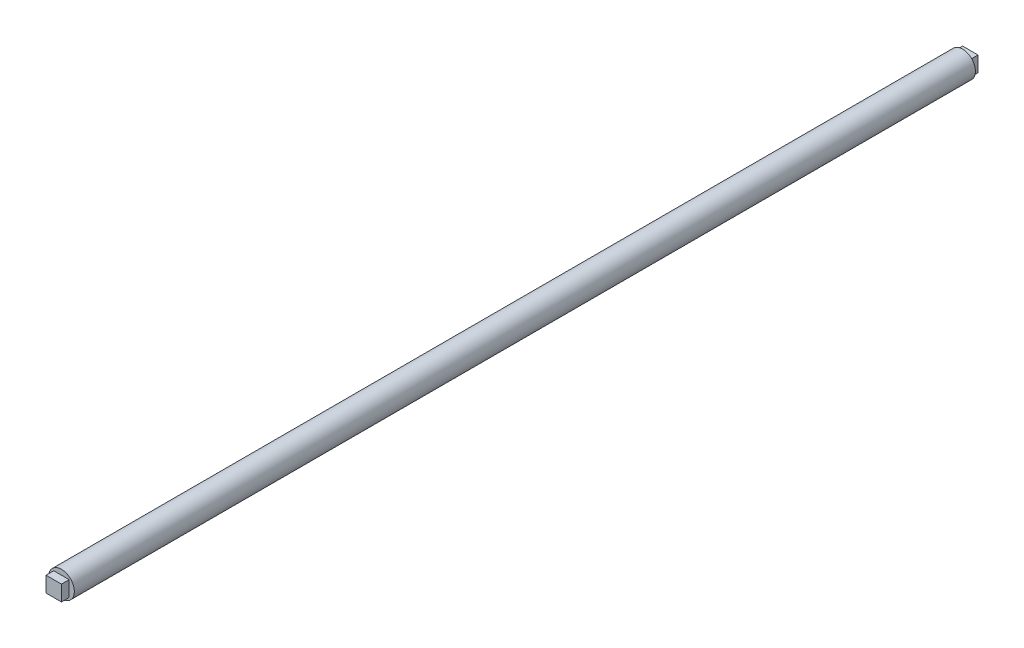
ISO-10303-21;
HEADER;
FILE_DESCRIPTION(('STEP AP214'),'2;1');
FILE_NAME('part.step','',(''),(''),'','','');
FILE_SCHEMA(('AUTOMOTIVE_DESIGN { 1 0 10303 214 1 1 1 1 }'));
ENDSEC;
DATA;
#1=APPLICATION_CONTEXT('core data for automotive mechanical design processes');
#2=APPLICATION_PROTOCOL_DEFINITION('international standard','automotive_design',2000,#1);
#3=PRODUCT_CONTEXT('',#1,'mechanical');
#4=PRODUCT('Part','Part','',(#3));
#5=PRODUCT_RELATED_PRODUCT_CATEGORY('part','',(#4));
#6=PRODUCT_DEFINITION_FORMATION('','',#4);
#7=PRODUCT_DEFINITION_CONTEXT('part definition',#1,'design');
#8=PRODUCT_DEFINITION('design','',#6,#7);
#9=PRODUCT_DEFINITION_SHAPE('','',#8);
#10=(LENGTH_UNIT() NAMED_UNIT(*) SI_UNIT(.MILLI.,.METRE.));
#11=(NAMED_UNIT(*) PLANE_ANGLE_UNIT() SI_UNIT($,.RADIAN.));
#12=(NAMED_UNIT(*) SI_UNIT($,.STERADIAN.) SOLID_ANGLE_UNIT());
#13=UNCERTAINTY_MEASURE_WITH_UNIT(LENGTH_MEASURE(1.E-05),#10,'distance_accuracy_value','');
#14=(GEOMETRIC_REPRESENTATION_CONTEXT(3) GLOBAL_UNCERTAINTY_ASSIGNED_CONTEXT((#13)) GLOBAL_UNIT_ASSIGNED_CONTEXT((#10,
#11,#12)) REPRESENTATION_CONTEXT('',''));
#15=CARTESIAN_POINT('',(0.,0.,0.));
#16=DIRECTION('',(0.,0.,1.));
#17=DIRECTION('',(1.,0.,0.));
#18=AXIS2_PLACEMENT_3D('',#15,#16,#17);
#19=CARTESIAN_POINT('',(0.,0.,175.));
#20=DIRECTION('',(0.,0.,-1.));
#21=DIRECTION('',(-1.,0.,0.));
#22=AXIS2_PLACEMENT_3D('',#19,#20,#21);
#23=CYLINDRICAL_SURFACE('',#22,5.);
#24=CARTESIAN_POINT('',(0.,0.,175.));
#25=DIRECTION('',(0.,0.,1.));
#26=DIRECTION('',(1.,0.,0.));
#27=AXIS2_PLACEMENT_3D('',#24,#25,#26);
#28=CIRCLE('',#27,5.);
#29=CARTESIAN_POINT('',(5.,0.,175.));
#30=VERTEX_POINT('',#29);
#31=EDGE_CURVE('E11',#30,#30,#28,.T.);
#32=ORIENTED_EDGE('',*,*,#31,.F.);
#33=EDGE_LOOP('',(#32));
#34=FACE_BOUND('',#33,.T.);
#35=CARTESIAN_POINT('',(0.,0.,-175.));
#36=DIRECTION('',(0.,0.,1.));
#37=DIRECTION('',(1.,0.,0.));
#38=AXIS2_PLACEMENT_3D('',#35,#36,#37);
#39=CIRCLE('',#38,5.);
#40=CARTESIAN_POINT('',(5.,0.,-175.));
#41=VERTEX_POINT('',#40);
#42=EDGE_CURVE('E42',#41,#41,#39,.T.);
#43=ORIENTED_EDGE('',*,*,#42,.T.);
#44=EDGE_LOOP('',(#43));
#45=FACE_BOUND('',#44,.T.);
#46=ADVANCED_FACE('F39',(#34,#45),#23,.T.);
#47=CARTESIAN_POINT('',(0.,0.,175.));
#48=DIRECTION('',(0.,0.,1.));
#49=DIRECTION('',(1.,0.,0.));
#50=AXIS2_PLACEMENT_3D('',#47,#48,#49);
#51=PLANE('',#50);
#52=DIRECTION('',(1.,0.,0.));
#53=VECTOR('',#52,1.);
#54=CARTESIAN_POINT('',(-3.,-3.,175.));
#55=LINE('',#54,#53);
#56=CARTESIAN_POINT('',(-3.,-3.,175.));
#57=VERTEX_POINT('',#56);
#58=CARTESIAN_POINT('',(3.,-3.,175.));
#59=VERTEX_POINT('',#58);
#60=EDGE_CURVE('E62',#57,#59,#55,.T.);
#61=ORIENTED_EDGE('',*,*,#60,.F.);
#62=DIRECTION('',(0.,-1.,0.));
#63=VECTOR('',#62,1.);
#64=CARTESIAN_POINT('',(-3.,-3.,175.));
#65=LINE('',#64,#63);
#66=CARTESIAN_POINT('',(-3.,3.,175.));
#67=VERTEX_POINT('',#66);
#68=EDGE_CURVE('E159',#67,#57,#65,.T.);
#69=ORIENTED_EDGE('',*,*,#68,.F.);
#70=DIRECTION('',(-1.,0.,0.));
#71=VECTOR('',#70,1.);
#72=CARTESIAN_POINT('',(-3.,3.,175.));
#73=LINE('',#72,#71);
#74=CARTESIAN_POINT('',(3.,3.,175.));
#75=VERTEX_POINT('',#74);
#76=EDGE_CURVE('E175',#75,#67,#73,.T.);
#77=ORIENTED_EDGE('',*,*,#76,.F.);
#78=DIRECTION('',(0.,1.,0.));
#79=VECTOR('',#78,1.);
#80=CARTESIAN_POINT('',(3.,-3.,175.));
#81=LINE('',#80,#79);
#82=EDGE_CURVE('E171',#59,#75,#81,.T.);
#83=ORIENTED_EDGE('',*,*,#82,.F.);
#84=EDGE_LOOP('',(#61,#69,#77,#83));
#85=FACE_BOUND('',#84,.T.);
#86=ORIENTED_EDGE('',*,*,#31,.T.);
#87=EDGE_LOOP('',(#86));
#88=FACE_BOUND('',#87,.T.);
#89=ADVANCED_FACE('F205',(#85,#88),#51,.T.);
#90=CARTESIAN_POINT('',(0.,0.,-175.));
#91=DIRECTION('',(0.,0.,1.));
#92=DIRECTION('',(1.,0.,0.));
#93=AXIS2_PLACEMENT_3D('',#90,#91,#92);
#94=PLANE('',#93);
#95=DIRECTION('',(0.,-1.,0.));
#96=VECTOR('',#95,1.);
#97=CARTESIAN_POINT('',(-3.,-3.,-175.));
#98=LINE('',#97,#96);
#99=CARTESIAN_POINT('',(-3.,3.,-175.));
#100=VERTEX_POINT('',#99);
#101=CARTESIAN_POINT('',(-3.,-3.,-175.));
#102=VERTEX_POINT('',#101);
#103=EDGE_CURVE('E137',#100,#102,#98,.T.);
#104=ORIENTED_EDGE('',*,*,#103,.T.);
#105=DIRECTION('',(1.,0.,0.));
#106=VECTOR('',#105,1.);
#107=CARTESIAN_POINT('',(-3.,-3.,-175.));
#108=LINE('',#107,#106);
#109=CARTESIAN_POINT('',(3.,-3.,-175.));
#110=VERTEX_POINT('',#109);
#111=EDGE_CURVE('E54',#102,#110,#108,.T.);
#112=ORIENTED_EDGE('',*,*,#111,.T.);
#113=DIRECTION('',(0.,1.,0.));
#114=VECTOR('',#113,1.);
#115=CARTESIAN_POINT('',(3.,-3.,-175.));
#116=LINE('',#115,#114);
#117=CARTESIAN_POINT('',(3.,3.,-175.));
#118=VERTEX_POINT('',#117);
#119=EDGE_CURVE('E123',#110,#118,#116,.T.);
#120=ORIENTED_EDGE('',*,*,#119,.T.);
#121=DIRECTION('',(-1.,0.,0.));
#122=VECTOR('',#121,1.);
#123=CARTESIAN_POINT('',(-3.,3.,-175.));
#124=LINE('',#123,#122);
#125=EDGE_CURVE('E140',#118,#100,#124,.T.);
#126=ORIENTED_EDGE('',*,*,#125,.T.);
#127=EDGE_LOOP('',(#104,#112,#120,#126));
#128=FACE_BOUND('',#127,.T.);
#129=ORIENTED_EDGE('',*,*,#42,.F.);
#130=EDGE_LOOP('',(#129));
#131=FACE_BOUND('',#130,.T.);
#132=ADVANCED_FACE('F202',(#128,#131),#94,.F.);
#133=CARTESIAN_POINT('',(-3.,-3.,178.));
#134=DIRECTION('',(0.,1.,0.));
#135=DIRECTION('',(-1.,0.,0.));
#136=AXIS2_PLACEMENT_3D('',#133,#134,#135);
#137=PLANE('',#136);
#138=ORIENTED_EDGE('',*,*,#60,.T.);
#139=DIRECTION('',(0.,0.,-1.));
#140=VECTOR('',#139,1.);
#141=CARTESIAN_POINT('',(3.,-3.,178.));
#142=LINE('',#141,#140);
#143=CARTESIAN_POINT('',(3.,-3.,178.));
#144=VERTEX_POINT('',#143);
#145=EDGE_CURVE('E192',#144,#59,#142,.T.);
#146=ORIENTED_EDGE('',*,*,#145,.F.);
#147=DIRECTION('',(1.,0.,0.));
#148=VECTOR('',#147,1.);
#149=CARTESIAN_POINT('',(-3.,-3.,178.));
#150=LINE('',#149,#148);
#151=CARTESIAN_POINT('',(-3.,-3.,178.));
#152=VERTEX_POINT('',#151);
#153=EDGE_CURVE('E154',#152,#144,#150,.T.);
#154=ORIENTED_EDGE('',*,*,#153,.F.);
#155=DIRECTION('',(0.,0.,-1.));
#156=VECTOR('',#155,1.);
#157=CARTESIAN_POINT('',(-3.,-3.,178.));
#158=LINE('',#157,#156);
#159=EDGE_CURVE('E168',#152,#57,#158,.T.);
#160=ORIENTED_EDGE('',*,*,#159,.T.);
#161=EDGE_LOOP('',(#138,#146,#154,#160));
#162=FACE_BOUND('',#161,.T.);
#163=ADVANCED_FACE('F204',(#162),#137,.F.);
#164=CARTESIAN_POINT('',(3.,-3.,178.));
#165=DIRECTION('',(-1.,0.,0.));
#166=DIRECTION('',(0.,0.,1.));
#167=AXIS2_PLACEMENT_3D('',#164,#165,#166);
#168=PLANE('',#167);
#169=ORIENTED_EDGE('',*,*,#82,.T.);
#170=DIRECTION('',(0.,0.,-1.));
#171=VECTOR('',#170,1.);
#172=CARTESIAN_POINT('',(3.,3.,178.));
#173=LINE('',#172,#171);
#174=CARTESIAN_POINT('',(3.,3.,178.));
#175=VERTEX_POINT('',#174);
#176=EDGE_CURVE('E188',#175,#75,#173,.T.);
#177=ORIENTED_EDGE('',*,*,#176,.F.);
#178=DIRECTION('',(0.,1.,0.));
#179=VECTOR('',#178,1.);
#180=CARTESIAN_POINT('',(3.,-3.,178.));
#181=LINE('',#180,#179);
#182=EDGE_CURVE('E158',#144,#175,#181,.T.);
#183=ORIENTED_EDGE('',*,*,#182,.F.);
#184=ORIENTED_EDGE('',*,*,#145,.T.);
#185=EDGE_LOOP('',(#169,#177,#183,#184));
#186=FACE_BOUND('',#185,.T.);
#187=ADVANCED_FACE('F211',(#186),#168,.F.);
#188=CARTESIAN_POINT('',(-3.,3.,178.));
#189=DIRECTION('',(0.,-1.,0.));
#190=DIRECTION('',(0.,0.,-1.));
#191=AXIS2_PLACEMENT_3D('',#188,#189,#190);
#192=PLANE('',#191);
#193=ORIENTED_EDGE('',*,*,#76,.T.);
#194=DIRECTION('',(0.,0.,-1.));
#195=VECTOR('',#194,1.);
#196=CARTESIAN_POINT('',(-3.,3.,178.));
#197=LINE('',#196,#195);
#198=CARTESIAN_POINT('',(-3.,3.,178.));
#199=VERTEX_POINT('',#198);
#200=EDGE_CURVE('E184',#199,#67,#197,.T.);
#201=ORIENTED_EDGE('',*,*,#200,.F.);
#202=DIRECTION('',(-1.,0.,0.));
#203=VECTOR('',#202,1.);
#204=CARTESIAN_POINT('',(-3.,3.,178.));
#205=LINE('',#204,#203);
#206=EDGE_CURVE('E162',#175,#199,#205,.T.);
#207=ORIENTED_EDGE('',*,*,#206,.F.);
#208=ORIENTED_EDGE('',*,*,#176,.T.);
#209=EDGE_LOOP('',(#193,#201,#207,#208));
#210=FACE_BOUND('',#209,.T.);
#211=ADVANCED_FACE('F241',(#210),#192,.F.);
#212=CARTESIAN_POINT('',(-3.,-3.,178.));
#213=DIRECTION('',(1.,0.,0.));
#214=DIRECTION('',(0.,0.,-1.));
#215=AXIS2_PLACEMENT_3D('',#212,#213,#214);
#216=PLANE('',#215);
#217=ORIENTED_EDGE('',*,*,#68,.T.);
#218=ORIENTED_EDGE('',*,*,#159,.F.);
#219=DIRECTION('',(0.,-1.,0.));
#220=VECTOR('',#219,1.);
#221=CARTESIAN_POINT('',(-3.,-3.,178.));
#222=LINE('',#221,#220);
#223=EDGE_CURVE('E165',#199,#152,#222,.T.);
#224=ORIENTED_EDGE('',*,*,#223,.F.);
#225=ORIENTED_EDGE('',*,*,#200,.T.);
#226=EDGE_LOOP('',(#217,#218,#224,#225));
#227=FACE_BOUND('',#226,.T.);
#228=ADVANCED_FACE('F250',(#227),#216,.F.);
#229=CARTESIAN_POINT('',(0.,0.,178.));
#230=DIRECTION('',(0.,0.,1.));
#231=DIRECTION('',(1.,0.,0.));
#232=AXIS2_PLACEMENT_3D('',#229,#230,#231);
#233=PLANE('',#232);
#234=ORIENTED_EDGE('',*,*,#153,.T.);
#235=ORIENTED_EDGE('',*,*,#182,.T.);
#236=ORIENTED_EDGE('',*,*,#206,.T.);
#237=ORIENTED_EDGE('',*,*,#223,.T.);
#238=EDGE_LOOP('',(#234,#235,#236,#237));
#239=FACE_BOUND('',#238,.T.);
#240=ADVANCED_FACE('F260',(#239),#233,.T.);
#241=CARTESIAN_POINT('',(-3.,-3.,-178.));
#242=DIRECTION('',(0.,-1.,0.));
#243=DIRECTION('',(1.,0.,0.));
#244=AXIS2_PLACEMENT_3D('',#241,#242,#243);
#245=PLANE('',#244);
#246=ORIENTED_EDGE('',*,*,#111,.F.);
#247=DIRECTION('',(0.,0.,1.));
#248=VECTOR('',#247,1.);
#249=CARTESIAN_POINT('',(-3.,-3.,-178.));
#250=LINE('',#249,#248);
#251=CARTESIAN_POINT('',(-3.,-3.,-178.));
#252=VERTEX_POINT('',#251);
#253=EDGE_CURVE('E102',#252,#102,#250,.T.);
#254=ORIENTED_EDGE('',*,*,#253,.F.);
#255=DIRECTION('',(1.,0.,0.));
#256=VECTOR('',#255,1.);
#257=CARTESIAN_POINT('',(-3.,-3.,-178.));
#258=LINE('',#257,#256);
#259=CARTESIAN_POINT('',(3.,-3.,-178.));
#260=VERTEX_POINT('',#259);
#261=EDGE_CURVE('E105',#252,#260,#258,.T.);
#262=ORIENTED_EDGE('',*,*,#261,.T.);
#263=DIRECTION('',(0.,0.,1.));
#264=VECTOR('',#263,1.);
#265=CARTESIAN_POINT('',(3.,-3.,-178.));
#266=LINE('',#265,#264);
#267=EDGE_CURVE('E134',#260,#110,#266,.T.);
#268=ORIENTED_EDGE('',*,*,#267,.T.);
#269=EDGE_LOOP('',(#246,#254,#262,#268));
#270=FACE_BOUND('',#269,.T.);
#271=ADVANCED_FACE('F104',(#270),#245,.T.);
#272=CARTESIAN_POINT('',(-3.,-3.,-178.));
#273=DIRECTION('',(-1.,0.,0.));
#274=DIRECTION('',(0.,0.,1.));
#275=AXIS2_PLACEMENT_3D('',#272,#273,#274);
#276=PLANE('',#275);
#277=ORIENTED_EDGE('',*,*,#103,.F.);
#278=DIRECTION('',(0.,0.,1.));
#279=VECTOR('',#278,1.);
#280=CARTESIAN_POINT('',(-3.,3.,-178.));
#281=LINE('',#280,#279);
#282=CARTESIAN_POINT('',(-3.,3.,-178.));
#283=VERTEX_POINT('',#282);
#284=EDGE_CURVE('E112',#283,#100,#281,.T.);
#285=ORIENTED_EDGE('',*,*,#284,.F.);
#286=DIRECTION('',(0.,-1.,0.));
#287=VECTOR('',#286,1.);
#288=CARTESIAN_POINT('',(-3.,-3.,-178.));
#289=LINE('',#288,#287);
#290=EDGE_CURVE('E118',#283,#252,#289,.T.);
#291=ORIENTED_EDGE('',*,*,#290,.T.);
#292=ORIENTED_EDGE('',*,*,#253,.T.);
#293=EDGE_LOOP('',(#277,#285,#291,#292));
#294=FACE_BOUND('',#293,.T.);
#295=ADVANCED_FACE('F125',(#294),#276,.T.);
#296=CARTESIAN_POINT('',(-3.,3.,-178.));
#297=DIRECTION('',(0.,1.,0.));
#298=DIRECTION('',(0.,0.,1.));
#299=AXIS2_PLACEMENT_3D('',#296,#297,#298);
#300=PLANE('',#299);
#301=ORIENTED_EDGE('',*,*,#125,.F.);
#302=DIRECTION('',(0.,0.,1.));
#303=VECTOR('',#302,1.);
#304=CARTESIAN_POINT('',(3.,3.,-178.));
#305=LINE('',#304,#303);
#306=CARTESIAN_POINT('',(3.,3.,-178.));
#307=VERTEX_POINT('',#306);
#308=EDGE_CURVE('E149',#307,#118,#305,.T.);
#309=ORIENTED_EDGE('',*,*,#308,.F.);
#310=DIRECTION('',(-1.,0.,0.));
#311=VECTOR('',#310,1.);
#312=CARTESIAN_POINT('',(-3.,3.,-178.));
#313=LINE('',#312,#311);
#314=EDGE_CURVE('E127',#307,#283,#313,.T.);
#315=ORIENTED_EDGE('',*,*,#314,.T.);
#316=ORIENTED_EDGE('',*,*,#284,.T.);
#317=EDGE_LOOP('',(#301,#309,#315,#316));
#318=FACE_BOUND('',#317,.T.);
#319=ADVANCED_FACE('F290',(#318),#300,.T.);
#320=CARTESIAN_POINT('',(3.,-3.,-178.));
#321=DIRECTION('',(1.,0.,0.));
#322=DIRECTION('',(0.,0.,-1.));
#323=AXIS2_PLACEMENT_3D('',#320,#321,#322);
#324=PLANE('',#323);
#325=ORIENTED_EDGE('',*,*,#119,.F.);
#326=ORIENTED_EDGE('',*,*,#267,.F.);
#327=DIRECTION('',(0.,1.,0.));
#328=VECTOR('',#327,1.);
#329=CARTESIAN_POINT('',(3.,-3.,-178.));
#330=LINE('',#329,#328);
#331=EDGE_CURVE('E121',#260,#307,#330,.T.);
#332=ORIENTED_EDGE('',*,*,#331,.T.);
#333=ORIENTED_EDGE('',*,*,#308,.T.);
#334=EDGE_LOOP('',(#325,#326,#332,#333));
#335=FACE_BOUND('',#334,.T.);
#336=ADVANCED_FACE('F299',(#335),#324,.T.);
#337=CARTESIAN_POINT('',(0.,0.,-178.));
#338=DIRECTION('',(0.,0.,-1.));
#339=DIRECTION('',(1.,0.,0.));
#340=AXIS2_PLACEMENT_3D('',#337,#338,#339);
#341=PLANE('',#340);
#342=ORIENTED_EDGE('',*,*,#261,.F.);
#343=ORIENTED_EDGE('',*,*,#290,.F.);
#344=ORIENTED_EDGE('',*,*,#314,.F.);
#345=ORIENTED_EDGE('',*,*,#331,.F.);
#346=EDGE_LOOP('',(#342,#343,#344,#345));
#347=FACE_BOUND('',#346,.T.);
#348=ADVANCED_FACE('F116',(#347),#341,.T.);
#349=CLOSED_SHELL('',(#46,#89,#132,#163,#187,#211,#228,#240,#271,#295,#319,#336,#348));
#350=MANIFOLD_SOLID_BREP('B2',#349);
#351=ADVANCED_BREP_SHAPE_REPRESENTATION('',(#18,#350),#14);
#352=SHAPE_DEFINITION_REPRESENTATION(#9,#351);
ENDSEC;
END-ISO-10303-21;
